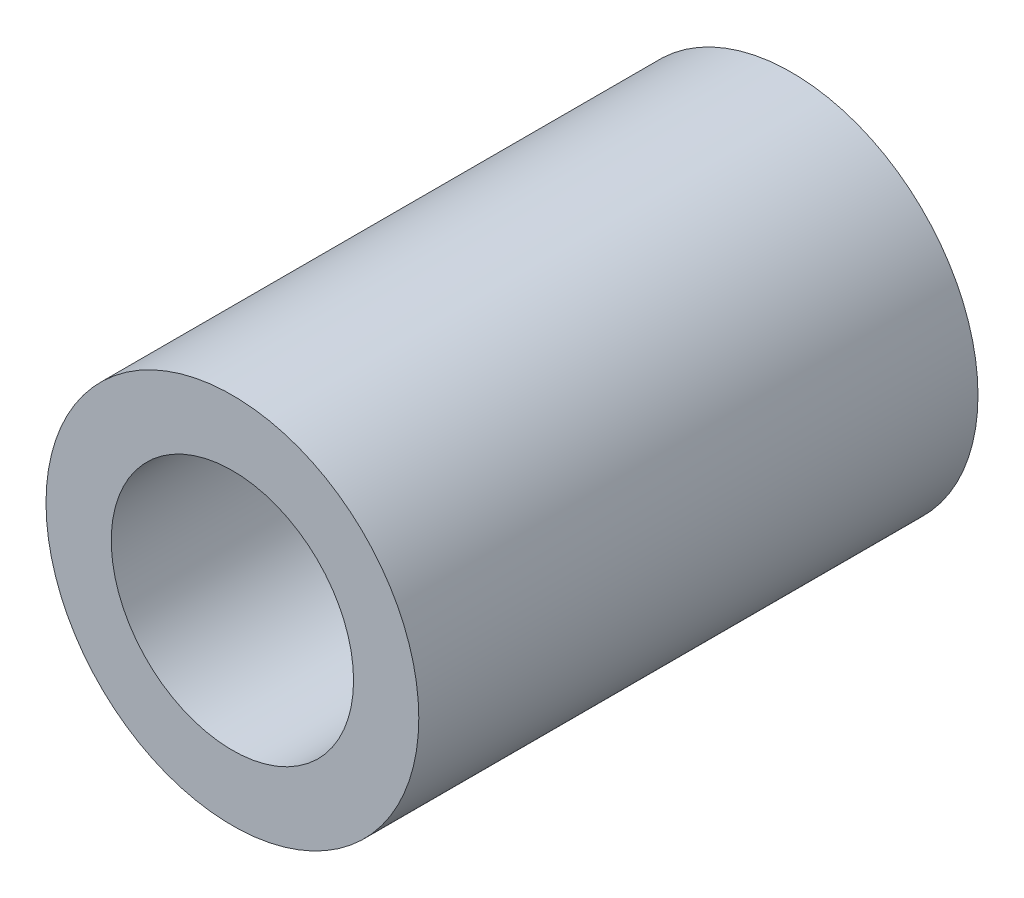
ISO-10303-21;
HEADER;
FILE_DESCRIPTION(('STEP AP214'),'2;1');
FILE_NAME('part.step','',(''),(''),'','','');
FILE_SCHEMA(('AUTOMOTIVE_DESIGN { 1 0 10303 214 1 1 1 1 }'));
ENDSEC;
DATA;
#1=APPLICATION_CONTEXT('core data for automotive mechanical design processes');
#2=APPLICATION_PROTOCOL_DEFINITION('international standard','automotive_design',2000,#1);
#3=PRODUCT_CONTEXT('',#1,'mechanical');
#4=PRODUCT('Part','Part','',(#3));
#5=PRODUCT_RELATED_PRODUCT_CATEGORY('part','',(#4));
#6=PRODUCT_DEFINITION_FORMATION('','',#4);
#7=PRODUCT_DEFINITION_CONTEXT('part definition',#1,'design');
#8=PRODUCT_DEFINITION('design','',#6,#7);
#9=PRODUCT_DEFINITION_SHAPE('','',#8);
#10=(LENGTH_UNIT() NAMED_UNIT(*) SI_UNIT(.MILLI.,.METRE.));
#11=(NAMED_UNIT(*) PLANE_ANGLE_UNIT() SI_UNIT($,.RADIAN.));
#12=(NAMED_UNIT(*) SI_UNIT($,.STERADIAN.) SOLID_ANGLE_UNIT());
#13=UNCERTAINTY_MEASURE_WITH_UNIT(LENGTH_MEASURE(1.E-05),#10,'distance_accuracy_value','');
#14=(GEOMETRIC_REPRESENTATION_CONTEXT(3) GLOBAL_UNCERTAINTY_ASSIGNED_CONTEXT((#13)) GLOBAL_UNIT_ASSIGNED_CONTEXT((#10,
#11,#12)) REPRESENTATION_CONTEXT('',''));
#15=CARTESIAN_POINT('',(0.,0.,0.));
#16=DIRECTION('',(0.,0.,1.));
#17=DIRECTION('',(1.,0.,0.));
#18=AXIS2_PLACEMENT_3D('',#15,#16,#17);
#19=CARTESIAN_POINT('',(0.,0.,12.));
#20=DIRECTION('',(0.,0.,1.));
#21=DIRECTION('',(1.,0.,0.));
#22=AXIS2_PLACEMENT_3D('',#19,#20,#21);
#23=PLANE('',#22);
#24=CARTESIAN_POINT('',(0.,0.,12.));
#25=DIRECTION('',(0.,0.,1.));
#26=DIRECTION('',(1.,0.,0.));
#27=AXIS2_PLACEMENT_3D('',#24,#25,#26);
#28=CIRCLE('',#27,4.);
#29=CARTESIAN_POINT('',(4.,0.,12.));
#30=VERTEX_POINT('',#29);
#31=EDGE_CURVE('E10',#30,#30,#28,.T.);
#32=ORIENTED_EDGE('',*,*,#31,.T.);
#33=EDGE_LOOP('',(#32));
#34=FACE_BOUND('',#33,.T.);
#35=CARTESIAN_POINT('',(0.,0.,12.));
#36=DIRECTION('',(0.,0.,1.));
#37=DIRECTION('',(1.,0.,0.));
#38=AXIS2_PLACEMENT_3D('',#35,#36,#37);
#39=CIRCLE('',#38,2.6);
#40=CARTESIAN_POINT('',(2.6,0.,12.));
#41=VERTEX_POINT('',#40);
#42=EDGE_CURVE('E50',#41,#41,#39,.T.);
#43=ORIENTED_EDGE('',*,*,#42,.F.);
#44=EDGE_LOOP('',(#43));
#45=FACE_BOUND('',#44,.T.);
#46=ADVANCED_FACE('F39',(#34,#45),#23,.T.);
#47=CARTESIAN_POINT('',(0.,0.,0.));
#48=DIRECTION('',(0.,0.,1.));
#49=DIRECTION('',(1.,0.,0.));
#50=AXIS2_PLACEMENT_3D('',#47,#48,#49);
#51=PLANE('',#50);
#52=CARTESIAN_POINT('',(0.,0.,0.));
#53=DIRECTION('',(0.,0.,1.));
#54=DIRECTION('',(1.,0.,0.));
#55=AXIS2_PLACEMENT_3D('',#52,#53,#54);
#56=CIRCLE('',#55,4.);
#57=CARTESIAN_POINT('',(4.,0.,0.));
#58=VERTEX_POINT('',#57);
#59=EDGE_CURVE('E43',#58,#58,#56,.T.);
#60=ORIENTED_EDGE('',*,*,#59,.F.);
#61=EDGE_LOOP('',(#60));
#62=FACE_BOUND('',#61,.T.);
#63=CARTESIAN_POINT('',(0.,0.,0.));
#64=DIRECTION('',(0.,0.,1.));
#65=DIRECTION('',(1.,0.,0.));
#66=AXIS2_PLACEMENT_3D('',#63,#64,#65);
#67=CIRCLE('',#66,2.6);
#68=CARTESIAN_POINT('',(2.6,0.,0.));
#69=VERTEX_POINT('',#68);
#70=EDGE_CURVE('E52',#69,#69,#67,.T.);
#71=ORIENTED_EDGE('',*,*,#70,.T.);
#72=EDGE_LOOP('',(#71));
#73=FACE_BOUND('',#72,.T.);
#74=ADVANCED_FACE('F62',(#62,#73),#51,.F.);
#75=CARTESIAN_POINT('',(0.,0.,12.));
#76=DIRECTION('',(0.,0.,-1.));
#77=DIRECTION('',(-1.,0.,0.));
#78=AXIS2_PLACEMENT_3D('',#75,#76,#77);
#79=CYLINDRICAL_SURFACE('',#78,4.);
#80=ORIENTED_EDGE('',*,*,#31,.F.);
#81=EDGE_LOOP('',(#80));
#82=FACE_BOUND('',#81,.T.);
#83=ORIENTED_EDGE('',*,*,#59,.T.);
#84=EDGE_LOOP('',(#83));
#85=FACE_BOUND('',#84,.T.);
#86=ADVANCED_FACE('F41',(#82,#85),#79,.T.);
#87=CARTESIAN_POINT('',(0.,0.,12.));
#88=DIRECTION('',(0.,0.,-1.));
#89=DIRECTION('',(-1.,0.,0.));
#90=AXIS2_PLACEMENT_3D('',#87,#88,#89);
#91=CYLINDRICAL_SURFACE('',#90,2.6);
#92=ORIENTED_EDGE('',*,*,#42,.T.);
#93=EDGE_LOOP('',(#92));
#94=FACE_BOUND('',#93,.T.);
#95=ORIENTED_EDGE('',*,*,#70,.F.);
#96=EDGE_LOOP('',(#95));
#97=FACE_BOUND('',#96,.T.);
#98=ADVANCED_FACE('F58',(#94,#97),#91,.F.);
#99=CLOSED_SHELL('',(#46,#74,#86,#98));
#100=MANIFOLD_SOLID_BREP('B2',#99);
#101=ADVANCED_BREP_SHAPE_REPRESENTATION('',(#18,#100),#14);
#102=SHAPE_DEFINITION_REPRESENTATION(#9,#101);
ENDSEC;
END-ISO-10303-21;
